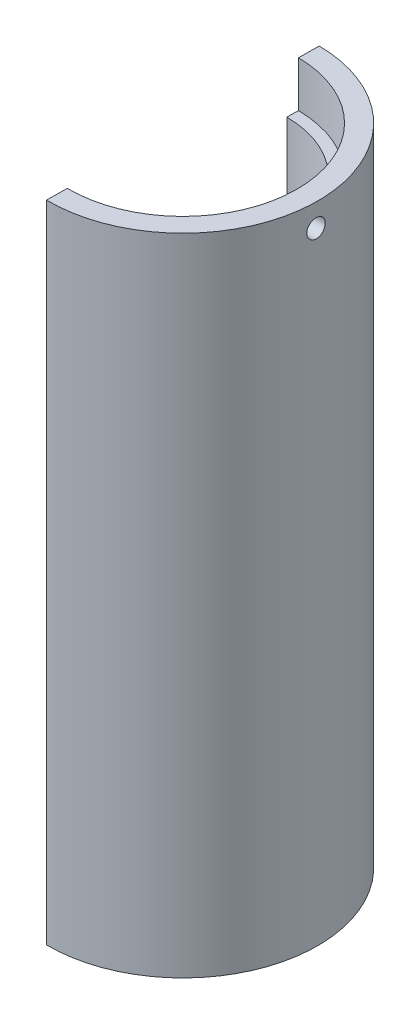
ISO-10303-21;
HEADER;
FILE_DESCRIPTION(('STEP AP214'),'2;1');
FILE_NAME('part.step','',(''),(''),'','','');
FILE_SCHEMA(('AUTOMOTIVE_DESIGN { 1 0 10303 214 1 1 1 1 }'));
ENDSEC;
DATA;
#1=APPLICATION_CONTEXT('core data for automotive mechanical design processes');
#2=APPLICATION_PROTOCOL_DEFINITION('international standard','automotive_design',2000,#1);
#3=PRODUCT_CONTEXT('',#1,'mechanical');
#4=PRODUCT('Part','Part','',(#3));
#5=PRODUCT_RELATED_PRODUCT_CATEGORY('part','',(#4));
#6=PRODUCT_DEFINITION_FORMATION('','',#4);
#7=PRODUCT_DEFINITION_CONTEXT('part definition',#1,'design');
#8=PRODUCT_DEFINITION('design','',#6,#7);
#9=PRODUCT_DEFINITION_SHAPE('','',#8);
#10=(LENGTH_UNIT() NAMED_UNIT(*) SI_UNIT(.MILLI.,.METRE.));
#11=(NAMED_UNIT(*) PLANE_ANGLE_UNIT() SI_UNIT($,.RADIAN.));
#12=(NAMED_UNIT(*) SI_UNIT($,.STERADIAN.) SOLID_ANGLE_UNIT());
#13=UNCERTAINTY_MEASURE_WITH_UNIT(LENGTH_MEASURE(1.E-05),#10,'distance_accuracy_value','');
#14=(GEOMETRIC_REPRESENTATION_CONTEXT(3) GLOBAL_UNCERTAINTY_ASSIGNED_CONTEXT((#13)) GLOBAL_UNIT_ASSIGNED_CONTEXT((#10,
#11,#12)) REPRESENTATION_CONTEXT('',''));
#15=CARTESIAN_POINT('',(0.,0.,0.));
#16=DIRECTION('',(0.,0.,1.));
#17=DIRECTION('',(1.,0.,0.));
#18=AXIS2_PLACEMENT_3D('',#15,#16,#17);
#19=CARTESIAN_POINT('',(0.,158.,0.));
#20=DIRECTION('',(0.,-1.,0.));
#21=DIRECTION('',(-0.401283076270889,0.,0.915954088750398));
#22=AXIS2_PLACEMENT_3D('',#19,#20,#21);
#23=CYLINDRICAL_SURFACE('',#22,22.5);
#24=DIRECTION('',(0.,-1.,0.));
#25=VECTOR('',#24,1.);
#26=CARTESIAN_POINT('',(-0.246759675838968,158.,22.4986468406965));
#27=LINE('',#26,#25);
#28=CARTESIAN_POINT('',(-0.246759675838986,119.,22.4986468406965));
#29=VERTEX_POINT('',#28);
#30=CARTESIAN_POINT('',(-0.246759675838977,157.,22.4986468406965));
#31=VERTEX_POINT('',#30);
#32=EDGE_CURVE('E246',#29,#31,#27,.F.);
#33=ORIENTED_EDGE('',*,*,#32,.T.);
#34=CARTESIAN_POINT('',(0.,157.,0.));
#35=DIRECTION('',(0.,-1.,0.));
#36=DIRECTION('',(0.,0.,1.));
#37=AXIS2_PLACEMENT_3D('',#34,#35,#36);
#38=CIRCLE('',#37,22.5);
#39=CARTESIAN_POINT('',(0.246759675839023,157.,-22.4986468406964));
#40=VERTEX_POINT('',#39);
#41=EDGE_CURVE('E151',#40,#31,#38,.T.);
#42=ORIENTED_EDGE('',*,*,#41,.F.);
#43=DIRECTION('',(0.,-1.,0.));
#44=VECTOR('',#43,1.);
#45=CARTESIAN_POINT('',(0.246759675839024,158.,-22.4986468406964));
#46=LINE('',#45,#44);
#47=CARTESIAN_POINT('',(0.246759675838999,119.,-22.4986468406964));
#48=VERTEX_POINT('',#47);
#49=EDGE_CURVE('E147',#48,#40,#46,.F.);
#50=ORIENTED_EDGE('',*,*,#49,.F.);
#51=CARTESIAN_POINT('',(0.,119.,0.));
#52=DIRECTION('',(0.,1.,0.));
#53=DIRECTION('',(0.,0.,-1.));
#54=AXIS2_PLACEMENT_3D('',#51,#52,#53);
#55=CIRCLE('',#54,22.5);
#56=EDGE_CURVE('E177',#29,#48,#55,.T.);
#57=ORIENTED_EDGE('',*,*,#56,.F.);
#58=EDGE_LOOP('',(#33,#42,#50,#57));
#59=FACE_BOUND('',#58,.T.);
#60=ADVANCED_FACE('F50',(#59),#23,.F.);
#61=CARTESIAN_POINT('',(0.112412741215621,247.,-10.2493835607617));
#62=DIRECTION('',(0.999939859586508,0.,0.0109670967039555));
#63=DIRECTION('',(-0.0109670967039554,0.,0.999939859586508));
#64=AXIS2_PLACEMENT_3D('',#61,#62,#63);
#65=PLANE('',#64);
#66=DIRECTION('',(0.,-1.,0.));
#67=VECTOR('',#66,1.);
#68=CARTESIAN_POINT('',(0.263210320894963,170.,-23.9985566300761));
#69=LINE('',#68,#67);
#70=CARTESIAN_POINT('',(0.263210320894963,170.,-23.9985566300761));
#71=VERTEX_POINT('',#70);
#72=CARTESIAN_POINT('',(0.263210320894956,157.,-23.9985566300761));
#73=VERTEX_POINT('',#72);
#74=EDGE_CURVE('E144',#71,#73,#69,.T.);
#75=ORIENTED_EDGE('',*,*,#74,.F.);
#76=DIRECTION('',(0.0109670967039554,0.,-0.999939859586508));
#77=VECTOR('',#76,1.);
#78=CARTESIAN_POINT('',(0.,170.,0.));
#79=LINE('',#78,#77);
#80=CARTESIAN_POINT('',(0.246759675839029,170.,-22.4986468406964));
#81=VERTEX_POINT('',#80);
#82=EDGE_CURVE('E252',#81,#71,#79,.T.);
#83=ORIENTED_EDGE('',*,*,#82,.F.);
#84=DIRECTION('',(0.,-1.,0.));
#85=VECTOR('',#84,1.);
#86=CARTESIAN_POINT('',(0.24675967583907,247.,-22.4986468406963));
#87=LINE('',#86,#85);
#88=CARTESIAN_POINT('',(0.246759675839067,237.,-22.4986468406963));
#89=VERTEX_POINT('',#88);
#90=EDGE_CURVE('E261',#81,#89,#87,.F.);
#91=ORIENTED_EDGE('',*,*,#90,.T.);
#92=DIRECTION('',(0.0109670967039554,0.,-0.999939859586508));
#93=VECTOR('',#92,1.);
#94=CARTESIAN_POINT('',(0.,237.,1.28191555927795E-13));
#95=LINE('',#94,#93);
#96=CARTESIAN_POINT('',(0.274177417598957,237.,-24.9984964896626));
#97=VERTEX_POINT('',#96);
#98=EDGE_CURVE('E73',#89,#97,#95,.T.);
#99=ORIENTED_EDGE('',*,*,#98,.T.);
#100=DIRECTION('',(0.,1.,0.));
#101=VECTOR('',#100,1.);
#102=CARTESIAN_POINT('',(0.274177417598957,237.,-24.9984964896626));
#103=LINE('',#102,#101);
#104=CARTESIAN_POINT('',(0.27417741759896,247.,-24.9984964896626));
#105=VERTEX_POINT('',#104);
#106=EDGE_CURVE('E249',#105,#97,#103,.F.);
#107=ORIENTED_EDGE('',*,*,#106,.F.);
#108=DIRECTION('',(0.0109670967039554,0.,-0.999939859586508));
#109=VECTOR('',#108,1.);
#110=CARTESIAN_POINT('',(0.,247.,1.33348633457717E-13));
#111=LINE('',#110,#109);
#112=CARTESIAN_POINT('',(0.323529352766761,247.,-29.4982258578019));
#113=VERTEX_POINT('',#112);
#114=EDGE_CURVE('E269',#105,#113,#111,.T.);
#115=ORIENTED_EDGE('',*,*,#114,.T.);
#116=DIRECTION('',(0.,-1.,0.));
#117=VECTOR('',#116,1.);
#118=CARTESIAN_POINT('',(0.323529352766681,106.,-29.498225857802));
#119=LINE('',#118,#117);
#120=CARTESIAN_POINT('',(0.323529352766681,106.,-29.498225857802));
#121=VERTEX_POINT('',#120);
#122=EDGE_CURVE('E270',#121,#113,#119,.F.);
#123=ORIENTED_EDGE('',*,*,#122,.F.);
#124=DIRECTION('',(0.0109670967039554,0.,-0.999939859586508));
#125=VECTOR('',#124,1.);
#126=CARTESIAN_POINT('',(0.112412741215542,106.,-10.2493835607618));
#127=LINE('',#126,#125);
#128=CARTESIAN_POINT('',(0.263210320894927,106.,-23.9985566300761));
#129=VERTEX_POINT('',#128);
#130=EDGE_CURVE('E274',#129,#121,#127,.T.);
#131=ORIENTED_EDGE('',*,*,#130,.F.);
#132=DIRECTION('',(0.,-1.,0.));
#133=VECTOR('',#132,1.);
#134=CARTESIAN_POINT('',(0.263210320894935,119.,-23.9985566300761));
#135=LINE('',#134,#133);
#136=CARTESIAN_POINT('',(0.263210320894935,119.,-23.9985566300761));
#137=VERTEX_POINT('',#136);
#138=EDGE_CURVE('E152',#129,#137,#135,.F.);
#139=ORIENTED_EDGE('',*,*,#138,.T.);
#140=DIRECTION('',(0.0109670967039588,0.,-0.999939859586508));
#141=VECTOR('',#140,1.);
#142=CARTESIAN_POINT('',(0.246759675838999,119.,-22.4986468406964));
#143=LINE('',#142,#141);
#144=EDGE_CURVE('E179',#48,#137,#143,.T.);
#145=ORIENTED_EDGE('',*,*,#144,.F.);
#146=ORIENTED_EDGE('',*,*,#49,.T.);
#147=DIRECTION('',(-0.0109670967039562,0.,0.999939859586508));
#148=VECTOR('',#147,1.);
#149=CARTESIAN_POINT('',(0.257726772542979,157.,-23.4985867002829));
#150=LINE('',#149,#148);
#151=EDGE_CURVE('E141',#73,#40,#150,.T.);
#152=ORIENTED_EDGE('',*,*,#151,.F.);
#153=EDGE_LOOP('',(#75,#83,#91,#99,#107,#115,#123,#131,#139,#145,#146,#152));
#154=FACE_BOUND('',#153,.T.);
#155=ADVANCED_FACE('F52',(#154),#65,.F.);
#156=CARTESIAN_POINT('',(0.112412741215542,106.,-10.2493835607618));
#157=DIRECTION('',(0.,1.,0.));
#158=DIRECTION('',(0.401283076270889,0.,-0.915954088750398));
#159=AXIS2_PLACEMENT_3D('',#156,#157,#158);
#160=PLANE('',#159);
#161=DIRECTION('',(-0.0109670967039554,0.,0.999939859586508));
#162=VECTOR('',#161,1.);
#163=CARTESIAN_POINT('',(0.112412741215542,106.,-10.2493835607618));
#164=LINE('',#163,#162);
#165=CARTESIAN_POINT('',(-0.263210320894935,106.,23.9985566300763));
#166=VERTEX_POINT('',#165);
#167=CARTESIAN_POINT('',(-0.323529352766688,106.,29.498225857802));
#168=VERTEX_POINT('',#167);
#169=EDGE_CURVE('E182',#166,#168,#164,.T.);
#170=ORIENTED_EDGE('',*,*,#169,.F.);
#171=CARTESIAN_POINT('',(0.,106.,0.));
#172=DIRECTION('',(0.,-1.,0.));
#173=DIRECTION('',(0.,0.,-1.));
#174=AXIS2_PLACEMENT_3D('',#171,#172,#173);
#175=CIRCLE('',#174,24.);
#176=EDGE_CURVE('E162',#129,#166,#175,.T.);
#177=ORIENTED_EDGE('',*,*,#176,.F.);
#178=ORIENTED_EDGE('',*,*,#130,.T.);
#179=CARTESIAN_POINT('',(0.,106.,0.));
#180=DIRECTION('',(0.,1.,0.));
#181=DIRECTION('',(0.401283076270889,0.,-0.915954088750398));
#182=AXIS2_PLACEMENT_3D('',#179,#180,#181);
#183=CIRCLE('',#182,29.5);
#184=EDGE_CURVE('E266',#168,#121,#183,.T.);
#185=ORIENTED_EDGE('',*,*,#184,.F.);
#186=EDGE_LOOP('',(#170,#177,#178,#185));
#187=FACE_BOUND('',#186,.T.);
#188=ADVANCED_FACE('F243',(#187),#160,.F.);
#189=CARTESIAN_POINT('',(0.112412741215621,247.,-10.2493835607617));
#190=DIRECTION('',(-0.999939859586508,0.,-0.0109670967039555));
#191=DIRECTION('',(0.0109670967039554,0.,-0.999939859586508));
#192=AXIS2_PLACEMENT_3D('',#189,#190,#191);
#193=PLANE('',#192);
#194=DIRECTION('',(-0.0109670967039554,0.,0.999939859586508));
#195=VECTOR('',#194,1.);
#196=CARTESIAN_POINT('',(0.,170.,0.));
#197=LINE('',#196,#195);
#198=CARTESIAN_POINT('',(-0.246759675838963,170.,22.4986468406965));
#199=VERTEX_POINT('',#198);
#200=CARTESIAN_POINT('',(-0.263210320894899,170.,23.9985566300763));
#201=VERTEX_POINT('',#200);
#202=EDGE_CURVE('E257',#199,#201,#197,.T.);
#203=ORIENTED_EDGE('',*,*,#202,.T.);
#204=DIRECTION('',(0.,-1.,0.));
#205=VECTOR('',#204,1.);
#206=CARTESIAN_POINT('',(-0.263210320894899,170.,23.9985566300763));
#207=LINE('',#206,#205);
#208=CARTESIAN_POINT('',(-0.263210320894906,157.,23.9985566300763));
#209=VERTEX_POINT('',#208);
#210=EDGE_CURVE('E11',#201,#209,#207,.T.);
#211=ORIENTED_EDGE('',*,*,#210,.T.);
#212=DIRECTION('',(-0.0109670967039494,0.,0.999939859586509));
#213=VECTOR('',#212,1.);
#214=CARTESIAN_POINT('',(-0.246759675838975,157.,22.4986468406965));
#215=LINE('',#214,#213);
#216=EDGE_CURVE('E166',#31,#209,#215,.T.);
#217=ORIENTED_EDGE('',*,*,#216,.F.);
#218=ORIENTED_EDGE('',*,*,#32,.F.);
#219=DIRECTION('',(0.010967096703959,0.,-0.999939859586508));
#220=VECTOR('',#219,1.);
#221=CARTESIAN_POINT('',(-0.257726772542947,119.,23.498586700283));
#222=LINE('',#221,#220);
#223=CARTESIAN_POINT('',(-0.263210320894927,119.,23.9985566300763));
#224=VERTEX_POINT('',#223);
#225=EDGE_CURVE('E65',#224,#29,#222,.T.);
#226=ORIENTED_EDGE('',*,*,#225,.F.);
#227=DIRECTION('',(0.,-1.,0.));
#228=VECTOR('',#227,1.);
#229=CARTESIAN_POINT('',(-0.263210320894927,119.,23.9985566300763));
#230=LINE('',#229,#228);
#231=EDGE_CURVE('E58',#166,#224,#230,.F.);
#232=ORIENTED_EDGE('',*,*,#231,.F.);
#233=ORIENTED_EDGE('',*,*,#169,.T.);
#234=DIRECTION('',(0.,-1.,0.));
#235=VECTOR('',#234,1.);
#236=CARTESIAN_POINT('',(-0.323529352766688,106.,29.498225857802));
#237=LINE('',#236,#235);
#238=CARTESIAN_POINT('',(-0.32352935276661,247.,29.4982258578021));
#239=VERTEX_POINT('',#238);
#240=EDGE_CURVE('E259',#168,#239,#237,.F.);
#241=ORIENTED_EDGE('',*,*,#240,.T.);
#242=DIRECTION('',(-0.0109670967039554,0.,0.999939859586508));
#243=VECTOR('',#242,1.);
#244=CARTESIAN_POINT('',(0.,247.,1.33348633457717E-13));
#245=LINE('',#244,#243);
#246=CARTESIAN_POINT('',(-0.274177417598813,247.,24.9984964896628));
#247=VERTEX_POINT('',#246);
#248=EDGE_CURVE('E248',#247,#239,#245,.T.);
#249=ORIENTED_EDGE('',*,*,#248,.F.);
#250=DIRECTION('',(0.,1.,0.));
#251=VECTOR('',#250,1.);
#252=CARTESIAN_POINT('',(-0.274177417598815,237.,24.9984964896628));
#253=LINE('',#252,#251);
#254=CARTESIAN_POINT('',(-0.274177417598815,237.,24.9984964896628));
#255=VERTEX_POINT('',#254);
#256=EDGE_CURVE('E268',#247,#255,#253,.F.);
#257=ORIENTED_EDGE('',*,*,#256,.T.);
#258=DIRECTION('',(-0.0109670967039554,0.,0.999939859586508));
#259=VECTOR('',#258,1.);
#260=CARTESIAN_POINT('',(0.,237.,1.28191555927795E-13));
#261=LINE('',#260,#259);
#262=CARTESIAN_POINT('',(-0.246759675838923,237.,22.4986468406966));
#263=VERTEX_POINT('',#262);
#264=EDGE_CURVE('E221',#263,#255,#261,.T.);
#265=ORIENTED_EDGE('',*,*,#264,.F.);
#266=DIRECTION('',(0.,-1.,0.));
#267=VECTOR('',#266,1.);
#268=CARTESIAN_POINT('',(-0.24675967583892,247.,22.4986468406966));
#269=LINE('',#268,#267);
#270=EDGE_CURVE('E264',#199,#263,#269,.F.);
#271=ORIENTED_EDGE('',*,*,#270,.F.);
#272=EDGE_LOOP('',(#203,#211,#217,#218,#226,#232,#233,#241,#249,#257,#265,#271));
#273=FACE_BOUND('',#272,.T.);
#274=ADVANCED_FACE('F237',(#273),#193,.T.);
#275=CARTESIAN_POINT('',(0.,106.,0.));
#276=DIRECTION('',(0.,-1.,0.));
#277=DIRECTION('',(-0.401283076270889,0.,0.915954088750398));
#278=AXIS2_PLACEMENT_3D('',#275,#276,#277);
#279=CYLINDRICAL_SURFACE('',#278,29.5);
#280=ORIENTED_EDGE('',*,*,#184,.T.);
#281=ORIENTED_EDGE('',*,*,#122,.T.);
#282=CARTESIAN_POINT('',(0.,247.,1.33343877237688E-13));
#283=DIRECTION('',(0.,1.,0.));
#284=DIRECTION('',(0.401283076270889,0.,-0.915954088750398));
#285=AXIS2_PLACEMENT_3D('',#282,#283,#284);
#286=CIRCLE('',#285,29.5);
#287=EDGE_CURVE('E294',#239,#113,#286,.T.);
#288=ORIENTED_EDGE('',*,*,#287,.F.);
#289=ORIENTED_EDGE('',*,*,#240,.F.);
#290=EDGE_LOOP('',(#280,#281,#288,#289));
#291=FACE_BOUND('',#290,.T.);
#292=CARTESIAN_POINT('',(29.4084210519292,242.,2.32266468360173));
#293=CARTESIAN_POINT('',(29.4084220120332,242.112202285115,2.32265976436561));
#294=CARTESIAN_POINT('',(29.4091734268653,242.224482640083,2.31319861341218));
#295=CARTESIAN_POINT('',(29.4121067242641,242.445941578137,2.27559223731867));
#296=CARTESIAN_POINT('',(29.4142902617678,242.55511642007,2.24742539572096));
#297=CARTESIAN_POINT('',(29.4198655907828,242.767124504594,2.17321993342856));
#298=CARTESIAN_POINT('',(29.4232567337118,242.869961116618,2.12719090499129));
#299=CARTESIAN_POINT('',(29.430906893695,243.066416403162,2.01858088401622));
#300=CARTESIAN_POINT('',(29.4351657149756,243.160037149997,1.95600362429721));
#301=CARTESIAN_POINT('',(29.444137592895,243.335592840977,1.8159510342851));
#302=CARTESIAN_POINT('',(29.4488513396047,243.417509549347,1.73845288774862));
#303=CARTESIAN_POINT('',(29.4582690308026,243.567175613971,1.57080226663083));
#304=CARTESIAN_POINT('',(29.4629729748692,243.634924373018,1.48064925889107));
#305=CARTESIAN_POINT('',(29.4719294668647,243.754388659313,1.29014018911092));
#306=CARTESIAN_POINT('',(29.4761815825413,243.806088922616,1.18977453338961));
#307=CARTESIAN_POINT('',(29.4838427268428,243.8918909368,0.981753371019112));
#308=CARTESIAN_POINT('',(29.4872517657912,243.925992903181,0.874097953654704));
#309=CARTESIAN_POINT('',(29.4929371989243,243.97557921303,0.65472830701561));
#310=CARTESIAN_POINT('',(29.4952153424178,243.991092363225,0.543020634978423));
#311=CARTESIAN_POINT('',(29.498493341226,244.003149660578,0.318568448921587));
#312=CARTESIAN_POINT('',(29.4994932130794,243.999694053164,0.205823948335827));
#313=CARTESIAN_POINT('',(29.5002056085473,243.973935640675,-0.0173061036636653));
#314=CARTESIAN_POINT('',(29.499920245198,243.951663820011,-0.127695227446173));
#315=CARTESIAN_POINT('',(29.4982007364721,243.888953300624,-0.34317697798144));
#316=CARTESIAN_POINT('',(29.4967665833492,243.848514479402,-0.448269569014518));
#317=CARTESIAN_POINT('',(29.4930054665684,243.750582908417,-0.650271975616107));
#318=CARTESIAN_POINT('',(29.4906777693063,243.693076154621,-0.747174987526397));
#319=CARTESIAN_POINT('',(29.4854799949416,243.562651305947,-0.929970018999141));
#320=CARTESIAN_POINT('',(29.4826099106212,243.48973300598,-1.01586189200757));
#321=CARTESIAN_POINT('',(29.4767224034061,243.330380036604,-1.17437397884964));
#322=CARTESIAN_POINT('',(29.4737046956809,243.243918467079,-1.24696714202696));
#323=CARTESIAN_POINT('',(29.4679346507272,243.060027415318,-1.37660888512965));
#324=CARTESIAN_POINT('',(29.4651823136253,242.962597927841,-1.43365745762726));
#325=CARTESIAN_POINT('',(29.4603067562287,242.759519100822,-1.53058576455017));
#326=CARTESIAN_POINT('',(29.4581835799093,242.653869187362,-1.57046429896034));
#327=CARTESIAN_POINT('',(29.4548444219778,242.437356671315,-1.63189915134323));
#328=CARTESIAN_POINT('',(29.4536284277958,242.326494140978,-1.65345572318754));
#329=CARTESIAN_POINT('',(29.4522632200991,242.102939511937,-1.6775995382469));
#330=CARTESIAN_POINT('',(29.4521118888875,241.990251492285,-1.68022443828263));
#331=CARTESIAN_POINT('',(29.4528899666546,241.766037131851,-1.66652867775531));
#332=CARTESIAN_POINT('',(29.453819369001,241.654510783943,-1.65020813345916));
#333=CARTESIAN_POINT('',(29.4566371353761,241.435892372325,-1.59911709801961));
#334=CARTESIAN_POINT('',(29.4585245952288,241.328796230441,-1.56436400139068));
#335=CARTESIAN_POINT('',(29.4630129439798,241.121952317883,-1.47741410221898));
#336=CARTESIAN_POINT('',(29.4656138404885,241.022204625609,-1.42521711359872));
#337=CARTESIAN_POINT('',(29.4711928346666,240.83271637313,-1.30476803306612));
#338=CARTESIAN_POINT('',(29.474171520773,240.742991843884,-1.23649074953034));
#339=CARTESIAN_POINT('',(29.4801047475575,240.576258478335,-1.08585928583884));
#340=CARTESIAN_POINT('',(29.4830592879584,240.499249787876,-1.00350494424873));
#341=CARTESIAN_POINT('',(29.4885408536016,240.36000667794,-0.826898485595481));
#342=CARTESIAN_POINT('',(29.4910671716046,240.297796632423,-0.732627126405968));
#343=CARTESIAN_POINT('',(29.4953144454842,240.19008361552,-0.534962605191326));
#344=CARTESIAN_POINT('',(29.4970354070374,240.144580526374,-0.431569507467902));
#345=CARTESIAN_POINT('',(29.4993811360519,240.071615363988,-0.21868820956401));
#346=CARTESIAN_POINT('',(29.5000068366792,240.04413794531,-0.1092052800907));
#347=CARTESIAN_POINT('',(29.4999930526331,240.007953901931,0.112819396525069));
#348=CARTESIAN_POINT('',(29.4993535830162,239.999247053848,0.225361107250123));
#349=CARTESIAN_POINT('',(29.4967801607378,240.000853557772,0.450067154595547));
#350=CARTESIAN_POINT('',(29.4948488065581,240.011128802363,0.562231795403566));
#351=CARTESIAN_POINT('',(29.4898080454503,240.050328698884,0.78322576668621));
#352=CARTESIAN_POINT('',(29.4866986365402,240.079253382193,0.892055091548803));
#353=CARTESIAN_POINT('',(29.4795508171104,240.154922211972,1.10329584739434));
#354=CARTESIAN_POINT('',(29.4755124217599,240.201666067485,1.2057073831372));
#355=CARTESIAN_POINT('',(29.4668653190825,240.311641369302,1.40122688179467));
#356=CARTESIAN_POINT('',(29.4622566252278,240.374872426165,1.49433506438973));
#357=CARTESIAN_POINT('',(29.4528905290527,240.516168942565,1.66880196572947));
#358=CARTESIAN_POINT('',(29.4481328624734,240.594262175756,1.75013817648692));
#359=CARTESIAN_POINT('',(29.4389359183454,240.76302465399,1.89857809259877));
#360=CARTESIAN_POINT('',(29.4344967188067,240.853696964481,1.96567831861404));
#361=CARTESIAN_POINT('',(29.426370541703,241.045163536418,2.08380379392782));
#362=CARTESIAN_POINT('',(29.4226846121643,241.145971612926,2.13480669994219));
#363=CARTESIAN_POINT('',(29.4164469637509,241.354675518109,2.21911055427343));
#364=CARTESIAN_POINT('',(29.4138939225591,241.46256291393,2.25243214931489));
#365=CARTESIAN_POINT('',(29.4108455379735,241.642587641303,2.2918083362102));
#366=CARTESIAN_POINT('',(29.4099400388713,241.713562535742,2.30336443667684));
#367=CARTESIAN_POINT('',(29.4087274889752,241.85634761886,2.31879417883486));
#368=CARTESIAN_POINT('',(29.4084204371826,241.928157806145,2.32266783334787));
#369=CARTESIAN_POINT('',(29.4084210519292,242.,2.32266468360173));
#370=B_SPLINE_CURVE_WITH_KNOTS('',3,(#292,#293,#294,#295,#296,#297,#298,#299,#300,#301,#302,
#303,#304,#305,#306,#307,#308,#309,#310,#311,#312,#313,#314,#315,#316,#317,#318,#319,#320,#321,
#322,#323,#324,#325,#326,#327,#328,#329,#330,#331,#332,#333,#334,#335,#336,#337,#338,#339,#340,
#341,#342,#343,#344,#345,#346,#347,#348,#349,#350,#351,#352,#353,#354,#355,#356,#357,#358,#359,
#360,#361,#362,#363,#364,#365,#366,#367,#368,#369),.UNSPECIFIED.,.T.,.F.,(4,2,2,2,2,2,2,2,2,2,2,
2,2,2,2,2,2,2,2,2,2,2,2,2,2,2,2,2,2,2,2,2,2,2,2,2,2,2,4),(0.,0.336344577659572,
0.673078515941869,1.00963187282268,1.34610937732773,1.68310555195412,2.0201159287366,
2.35744586547342,2.6947716713509,3.03157405113571,3.36837207320016,3.7046165729478,
4.04086334001643,4.37738675977417,4.71391465806419,5.05111965976264,5.38832482258944,
5.72555354888415,6.06277760241587,6.39933070110743,6.73588173440665,7.07211573331286,
7.4083533190086,7.74512120503262,8.08189295333861,8.41921559612666,8.75653586122229,
9.09356858818394,9.430597304239,9.76695015494149,10.1033035715632,10.4396514963348,
10.775991477032,11.1129662761444,11.4500233387894,11.7875462041373,12.1246740669139,
12.340033073674,12.5553917210098),.UNSPECIFIED.);
#371=CARTESIAN_POINT('',(29.4084210519292,242.,2.32266468360173));
#372=VERTEX_POINT('',#371);
#373=EDGE_CURVE('E183',#372,#372,#370,.T.);
#374=ORIENTED_EDGE('',*,*,#373,.T.);
#375=EDGE_LOOP('',(#374));
#376=FACE_BOUND('',#375,.T.);
#377=ADVANCED_FACE('F195',(#291,#376),#279,.T.);
#378=CARTESIAN_POINT('',(0.,247.,1.33343877237688E-13));
#379=DIRECTION('',(0.,1.,0.));
#380=DIRECTION('',(0.401283076270889,0.,-0.915954088750398));
#381=AXIS2_PLACEMENT_3D('',#378,#379,#380);
#382=PLANE('',#381);
#383=ORIENTED_EDGE('',*,*,#114,.F.);
#384=CARTESIAN_POINT('',(0.,247.,1.36309110168405E-13));
#385=DIRECTION('',(0.,1.,0.));
#386=DIRECTION('',(0.401283076270889,0.,-0.915954088750398));
#387=AXIS2_PLACEMENT_3D('',#384,#385,#386);
#388=CIRCLE('',#387,25.);
#389=EDGE_CURVE('E191',#247,#105,#388,.T.);
#390=ORIENTED_EDGE('',*,*,#389,.F.);
#391=ORIENTED_EDGE('',*,*,#248,.T.);
#392=ORIENTED_EDGE('',*,*,#287,.T.);
#393=EDGE_LOOP('',(#383,#390,#391,#392));
#394=FACE_BOUND('',#393,.T.);
#395=ADVANCED_FACE('F205',(#394),#382,.T.);
#396=CARTESIAN_POINT('',(-42.4974440324266,242.,-0.466101609917994));
#397=DIRECTION('',(0.999939859586508,0.,0.0109670967039554));
#398=DIRECTION('',(-0.0109670967039553,0.,0.999939859586508));
#399=AXIS2_PLACEMENT_3D('',#396,#397,#398);
#400=CYLINDRICAL_SURFACE('',#399,2.);
#401=CARTESIAN_POINT('',(24.8964387039649,242.,2.27317836073714));
#402=CARTESIAN_POINT('',(24.896439821218,241.887852146326,2.27317346686614));
#403=CARTESIAN_POINT('',(24.8973076604846,241.775627553608,2.26372273820471));
#404=CARTESIAN_POINT('',(24.9006938559735,241.554282343585,2.2261597833425));
#405=CARTESIAN_POINT('',(24.9032140914608,241.445165408219,2.19802630884708));
#406=CARTESIAN_POINT('',(24.9096440367344,241.233273441822,2.12391366170939));
#407=CARTESIAN_POINT('',(24.9135529684198,241.130494897094,2.07794448127426));
#408=CARTESIAN_POINT('',(24.9223613677533,240.934144292345,1.96947967310415));
#409=CARTESIAN_POINT('',(24.9272606208931,240.840570245099,1.90698762340052));
#410=CARTESIAN_POINT('',(24.9375684709039,240.665037588918,1.76708635603931));
#411=CARTESIAN_POINT('',(24.942978118671,240.583103855833,1.68964600156202));
#412=CARTESIAN_POINT('',(24.9537616307937,240.433391219468,1.52210778480448));
#413=CARTESIAN_POINT('',(24.9591354935889,240.365612929514,1.43200937435918));
#414=CARTESIAN_POINT('',(24.9693335367477,240.24605323297,1.24156132151012));
#415=CARTESIAN_POINT('',(24.9741569764146,240.194293225377,1.14119820233208));
#416=CARTESIAN_POINT('',(24.9827948656352,240.108376259337,0.933160169316869));
#417=CARTESIAN_POINT('',(24.9866093316172,240.07421901427,0.825485374565353));
#418=CARTESIAN_POINT('',(24.9928913966692,240.024548436804,0.606124570455599));
#419=CARTESIAN_POINT('',(24.9953618851589,240.008995020947,0.494447720905179));
#420=CARTESIAN_POINT('',(24.9987932707288,239.996849716636,0.270045738311089));
#421=CARTESIAN_POINT('',(24.9997541939035,240.000257500412,0.157320623421698));
#422=CARTESIAN_POINT('',(25.0001618741609,240.025905032215,-0.0657060371606811));
#423=CARTESIAN_POINT('',(24.9996120906237,240.048101674888,-0.176012537868251));
#424=CARTESIAN_POINT('',(24.997168873999,240.11062984172,-0.39134376746273));
#425=CARTESIAN_POINT('',(24.9952754289801,240.150961526914,-0.496368449438961));
#426=CARTESIAN_POINT('',(24.9904504599225,240.248663090429,-0.698289409382496));
#427=CARTESIAN_POINT('',(24.9875177564597,240.306052314872,-0.795176296824752));
#428=CARTESIAN_POINT('',(24.9810320485548,240.436225837509,-0.9779650935034));
#429=CARTESIAN_POINT('',(24.9774790325329,240.509010423103,-1.06386679762046));
#430=CARTESIAN_POINT('',(24.9702191225868,240.668151616262,-1.22249475247285));
#431=CARTESIAN_POINT('',(24.966511825485,240.754545672068,-1.29518342061644));
#432=CARTESIAN_POINT('',(24.959437871794,240.938322766536,-1.42502738680839));
#433=CARTESIAN_POINT('',(24.9560712154548,241.03570581326,-1.48218267346065));
#434=CARTESIAN_POINT('',(24.9501120423946,241.238722485724,-1.57933208832999));
#435=CARTESIAN_POINT('',(24.9475196107468,241.344357016543,-1.61932433085397));
#436=CARTESIAN_POINT('',(24.9434412690636,241.560865785508,-1.68098209562102));
#437=CARTESIAN_POINT('',(24.9419553376118,241.671739922198,-1.70264797257261));
#438=CARTESIAN_POINT('',(24.9402818905969,241.895251896495,-1.72698890222354));
#439=CARTESIAN_POINT('',(24.9400907907444,242.007883999623,-1.7297163797901));
#440=CARTESIAN_POINT('',(24.9410217032883,242.232003494728,-1.71624014627882));
#441=CARTESIAN_POINT('',(24.9421437044109,242.343490896526,-1.70003659773637));
#442=CARTESIAN_POINT('',(24.9455561134001,242.562006294686,-1.64920315305008));
#443=CARTESIAN_POINT('',(24.9478449734909,242.669039995736,-1.61459766348135));
#444=CARTESIAN_POINT('',(24.9532999935024,242.875786298847,-1.52796991716825));
#445=CARTESIAN_POINT('',(24.9564661664131,242.97549879248,-1.47594740253732));
#446=CARTESIAN_POINT('',(24.9632796288909,243.165012079284,-1.35583290137279));
#447=CARTESIAN_POINT('',(24.9669279572698,243.254790679814,-1.28770596028175));
#448=CARTESIAN_POINT('',(24.9742274271944,243.42166353055,-1.13737112586925));
#449=CARTESIAN_POINT('',(24.9778785687839,243.498757579397,-1.05516300906083));
#450=CARTESIAN_POINT('',(24.9847061808342,243.638251376675,-0.878777297576226));
#451=CARTESIAN_POINT('',(24.9878815466043,243.700617115365,-0.784572758185567));
#452=CARTESIAN_POINT('',(24.993302606666,243.808650719895,-0.587006857217541));
#453=CARTESIAN_POINT('',(24.9955483096197,243.854318741316,-0.483645580968781));
#454=CARTESIAN_POINT('',(24.9987590954141,243.927602020653,-0.270825842406626));
#455=CARTESIAN_POINT('',(24.9997256777609,243.955238397657,-0.161374676441415));
#456=CARTESIAN_POINT('',(25.0001728000693,243.991742933376,0.0606165132573289));
#457=CARTESIAN_POINT('',(24.9996533657353,244.000611416724,0.173156483528627));
#458=CARTESIAN_POINT('',(24.99708667784,243.999324763226,0.397794572646053));
#459=CARTESIAN_POINT('',(24.9950436936963,243.989222667443,0.509893047899474));
#460=CARTESIAN_POINT('',(24.9895612330824,243.950392113785,0.730780283162179));
#461=CARTESIAN_POINT('',(24.9861217545976,243.921663629041,0.839569038396728));
#462=CARTESIAN_POINT('',(24.9781322190562,243.846409034824,1.05075496963364));
#463=CARTESIAN_POINT('',(24.9735822141898,243.799883761672,1.15315244571677));
#464=CARTESIAN_POINT('',(24.9637867724864,243.690362495371,1.34868261965664));
#465=CARTESIAN_POINT('',(24.9585413478983,243.627366792311,1.44181548064898));
#466=CARTESIAN_POINT('',(24.9478412764822,243.486493997156,1.61644766681382));
#467=CARTESIAN_POINT('',(24.9423861099874,243.408577746229,1.69791537107538));
#468=CARTESIAN_POINT('',(24.9318161771248,243.240144389546,1.84665036159844));
#469=CARTESIAN_POINT('',(24.9267014936641,243.149624231228,1.91391419784009));
#470=CARTESIAN_POINT('',(24.917319707484,242.958390065511,2.03241961366353));
#471=CARTESIAN_POINT('',(24.9130541105818,242.857658417507,2.08363281893136));
#472=CARTESIAN_POINT('',(24.9058228629396,242.649058503573,2.16836637695046));
#473=CARTESIAN_POINT('',(24.9028557133042,242.541198632799,2.20190713951307));
#474=CARTESIAN_POINT('',(24.8992908903199,242.360581735918,2.24177225827355));
#475=CARTESIAN_POINT('',(24.8982257921459,242.288987464722,2.25353400158978));
#476=CARTESIAN_POINT('',(24.8967993387638,242.144939480372,2.26923862483552));
#477=CARTESIAN_POINT('',(24.8964379818383,242.072485769316,2.27318152384721));
#478=CARTESIAN_POINT('',(24.8964387039649,242.,2.27317836073714));
#479=B_SPLINE_CURVE_WITH_KNOTS('',3,(#401,#402,#403,#404,#405,#406,#407,#408,#409,#410,#411,
#412,#413,#414,#415,#416,#417,#418,#419,#420,#421,#422,#423,#424,#425,#426,#427,#428,#429,#430,
#431,#432,#433,#434,#435,#436,#437,#438,#439,#440,#441,#442,#443,#444,#445,#446,#447,#448,#449,
#450,#451,#452,#453,#454,#455,#456,#457,#458,#459,#460,#461,#462,#463,#464,#465,#466,#467,#468,
#469,#470,#471,#472,#473,#474,#475,#476,#477,#478),.UNSPECIFIED.,.T.,.F.,(4,2,2,2,2,2,2,2,2,2,2,
2,2,2,2,2,2,2,2,2,2,2,2,2,2,2,2,2,2,2,2,2,2,2,2,2,2,2,4),(0.,0.33617890938389,0.672740818698476,
1.00911444549431,1.34541529007445,1.68242434822534,2.01944800526567,2.35691997146199,
2.69438644255222,3.03112449746248,3.36785673142907,3.70381852241057,4.03978329672295,
4.37613057520014,4.71248413315912,5.04977992078597,5.38707595586997,5.7244090399802,
6.06173559482737,6.39812799600611,6.73451750905463,7.07046197594156,7.40641141723671,
7.74309684057558,8.07978760805432,8.41724840176259,8.75470605111588,9.09176774920678,
9.42882361697633,9.76493849142067,10.1010538507349,10.4371534170066,10.7732470640349,
11.1102351838792,11.4473050618614,11.7849674942507,12.122239102542,12.3395258855511,
12.5568121382634),.UNSPECIFIED.);
#480=CARTESIAN_POINT('',(24.8964387039649,242.,2.27317836073714));
#481=VERTEX_POINT('',#480);
#482=EDGE_CURVE('E192',#481,#481,#479,.T.);
#483=ORIENTED_EDGE('',*,*,#482,.F.);
#484=EDGE_LOOP('',(#483));
#485=FACE_BOUND('',#484,.T.);
#486=ORIENTED_EDGE('',*,*,#373,.F.);
#487=EDGE_LOOP('',(#486));
#488=FACE_BOUND('',#487,.T.);
#489=ADVANCED_FACE('F199',(#485,#488),#400,.F.);
#490=CARTESIAN_POINT('',(0.,237.,1.28158262387593E-13));
#491=DIRECTION('',(0.,1.,0.));
#492=DIRECTION('',(0.401283076270889,0.,-0.915954088750398));
#493=AXIS2_PLACEMENT_3D('',#490,#491,#492);
#494=CYLINDRICAL_SURFACE('',#493,25.);
#495=ORIENTED_EDGE('',*,*,#482,.T.);
#496=EDGE_LOOP('',(#495));
#497=FACE_BOUND('',#496,.T.);
#498=ORIENTED_EDGE('',*,*,#389,.T.);
#499=ORIENTED_EDGE('',*,*,#106,.T.);
#500=CARTESIAN_POINT('',(0.,237.,1.28158262387593E-13));
#501=DIRECTION('',(0.,1.,0.));
#502=DIRECTION('',(0.401283076270889,0.,-0.915954088750398));
#503=AXIS2_PLACEMENT_3D('',#500,#501,#502);
#504=CIRCLE('',#503,25.);
#505=EDGE_CURVE('E193',#255,#97,#504,.T.);
#506=ORIENTED_EDGE('',*,*,#505,.F.);
#507=ORIENTED_EDGE('',*,*,#256,.F.);
#508=EDGE_LOOP('',(#498,#499,#506,#507));
#509=FACE_BOUND('',#508,.T.);
#510=ADVANCED_FACE('F204',(#497,#509),#494,.F.);
#511=CARTESIAN_POINT('',(0.,247.,1.33343877237688E-13));
#512=DIRECTION('',(0.,-1.,0.));
#513=DIRECTION('',(-0.401283076270889,0.,0.915954088750398));
#514=AXIS2_PLACEMENT_3D('',#511,#512,#513);
#515=CYLINDRICAL_SURFACE('',#514,22.5);
#516=ORIENTED_EDGE('',*,*,#90,.F.);
#517=CARTESIAN_POINT('',(0.,170.,0.));
#518=DIRECTION('',(0.,1.,0.));
#519=DIRECTION('',(0.401283076270889,0.,-0.915954088750398));
#520=AXIS2_PLACEMENT_3D('',#517,#518,#519);
#521=CIRCLE('',#520,22.5);
#522=EDGE_CURVE('E292',#199,#81,#521,.T.);
#523=ORIENTED_EDGE('',*,*,#522,.F.);
#524=ORIENTED_EDGE('',*,*,#270,.T.);
#525=CARTESIAN_POINT('',(0.,237.,1.25193029456876E-13));
#526=DIRECTION('',(0.,1.,0.));
#527=DIRECTION('',(0.401283076270889,0.,-0.915954088750398));
#528=AXIS2_PLACEMENT_3D('',#525,#526,#527);
#529=CIRCLE('',#528,22.5);
#530=EDGE_CURVE('E219',#263,#89,#529,.T.);
#531=ORIENTED_EDGE('',*,*,#530,.T.);
#532=EDGE_LOOP('',(#516,#523,#524,#531));
#533=FACE_BOUND('',#532,.T.);
#534=ADVANCED_FACE('F226',(#533),#515,.F.);
#535=CARTESIAN_POINT('',(0.,237.,1.28158262387593E-13));
#536=DIRECTION('',(0.,1.,0.));
#537=DIRECTION('',(0.401283076270889,0.,-0.915954088750398));
#538=AXIS2_PLACEMENT_3D('',#535,#536,#537);
#539=PLANE('',#538);
#540=ORIENTED_EDGE('',*,*,#98,.F.);
#541=ORIENTED_EDGE('',*,*,#530,.F.);
#542=ORIENTED_EDGE('',*,*,#264,.T.);
#543=ORIENTED_EDGE('',*,*,#505,.T.);
#544=EDGE_LOOP('',(#540,#541,#542,#543));
#545=FACE_BOUND('',#544,.T.);
#546=ADVANCED_FACE('F209',(#545),#539,.T.);
#547=CARTESIAN_POINT('',(0.,170.,0.));
#548=DIRECTION('',(0.,1.,0.));
#549=DIRECTION('',(0.401283076270889,0.,-0.915954088750398));
#550=AXIS2_PLACEMENT_3D('',#547,#548,#549);
#551=PLANE('',#550);
#552=ORIENTED_EDGE('',*,*,#522,.T.);
#553=ORIENTED_EDGE('',*,*,#82,.T.);
#554=CARTESIAN_POINT('',(0.,170.,1.24435265820274E-13));
#555=DIRECTION('',(0.,1.,0.));
#556=DIRECTION('',(0.,0.,1.));
#557=AXIS2_PLACEMENT_3D('',#554,#555,#556);
#558=CIRCLE('',#557,24.);
#559=EDGE_CURVE('E161',#201,#71,#558,.T.);
#560=ORIENTED_EDGE('',*,*,#559,.F.);
#561=ORIENTED_EDGE('',*,*,#202,.F.);
#562=EDGE_LOOP('',(#552,#553,#560,#561));
#563=FACE_BOUND('',#562,.T.);
#564=ADVANCED_FACE('F234',(#563),#551,.F.);
#565=CARTESIAN_POINT('',(0.,119.,0.));
#566=DIRECTION('',(0.,-1.,0.));
#567=DIRECTION('',(0.,0.,-1.));
#568=AXIS2_PLACEMENT_3D('',#565,#566,#567);
#569=PLANE('',#568);
#570=ORIENTED_EDGE('',*,*,#56,.T.);
#571=ORIENTED_EDGE('',*,*,#144,.T.);
#572=CARTESIAN_POINT('',(0.,119.,0.));
#573=DIRECTION('',(0.,-1.,0.));
#574=DIRECTION('',(0.,0.,-1.));
#575=AXIS2_PLACEMENT_3D('',#572,#573,#574);
#576=CIRCLE('',#575,24.);
#577=EDGE_CURVE('E170',#137,#224,#576,.T.);
#578=ORIENTED_EDGE('',*,*,#577,.T.);
#579=ORIENTED_EDGE('',*,*,#225,.T.);
#580=EDGE_LOOP('',(#570,#571,#578,#579));
#581=FACE_BOUND('',#580,.T.);
#582=ADVANCED_FACE('F207',(#581),#569,.T.);
#583=CARTESIAN_POINT('',(0.,157.,0.));
#584=DIRECTION('',(0.,1.,0.));
#585=DIRECTION('',(0.,0.,1.));
#586=AXIS2_PLACEMENT_3D('',#583,#584,#585);
#587=PLANE('',#586);
#588=ORIENTED_EDGE('',*,*,#216,.T.);
#589=CARTESIAN_POINT('',(0.,157.,1.14919627845782E-13));
#590=DIRECTION('',(0.,1.,0.));
#591=DIRECTION('',(0.,0.,1.));
#592=AXIS2_PLACEMENT_3D('',#589,#590,#591);
#593=CIRCLE('',#592,24.);
#594=EDGE_CURVE('E159',#209,#73,#593,.T.);
#595=ORIENTED_EDGE('',*,*,#594,.T.);
#596=ORIENTED_EDGE('',*,*,#151,.T.);
#597=ORIENTED_EDGE('',*,*,#41,.T.);
#598=EDGE_LOOP('',(#588,#595,#596,#597));
#599=FACE_BOUND('',#598,.T.);
#600=ADVANCED_FACE('F164',(#599),#587,.T.);
#601=CARTESIAN_POINT('',(0.,119.,0.));
#602=DIRECTION('',(0.,-1.,0.));
#603=DIRECTION('',(0.,0.,-1.));
#604=AXIS2_PLACEMENT_3D('',#601,#602,#603);
#605=CYLINDRICAL_SURFACE('',#604,24.);
#606=ORIENTED_EDGE('',*,*,#176,.T.);
#607=ORIENTED_EDGE('',*,*,#231,.T.);
#608=ORIENTED_EDGE('',*,*,#577,.F.);
#609=ORIENTED_EDGE('',*,*,#138,.F.);
#610=EDGE_LOOP('',(#606,#607,#608,#609));
#611=FACE_BOUND('',#610,.T.);
#612=ADVANCED_FACE('F319',(#611),#605,.F.);
#613=CARTESIAN_POINT('',(0.,170.,1.24435265820274E-13));
#614=DIRECTION('',(0.,-1.,0.));
#615=DIRECTION('',(0.,0.,-1.));
#616=AXIS2_PLACEMENT_3D('',#613,#614,#615);
#617=CYLINDRICAL_SURFACE('',#616,24.);
#618=ORIENTED_EDGE('',*,*,#74,.T.);
#619=ORIENTED_EDGE('',*,*,#594,.F.);
#620=ORIENTED_EDGE('',*,*,#210,.F.);
#621=ORIENTED_EDGE('',*,*,#559,.T.);
#622=EDGE_LOOP('',(#618,#619,#620,#621));
#623=FACE_BOUND('',#622,.T.);
#624=ADVANCED_FACE('F157',(#623),#617,.F.);
#625=CLOSED_SHELL('',(#60,#155,#188,#274,#377,#395,#489,#510,#534,#546,#564,#582,#600,#612,#624));
#626=MANIFOLD_SOLID_BREP('B2',#625);
#627=ADVANCED_BREP_SHAPE_REPRESENTATION('',(#18,#626),#14);
#628=SHAPE_DEFINITION_REPRESENTATION(#9,#627);
ENDSEC;
END-ISO-10303-21;
